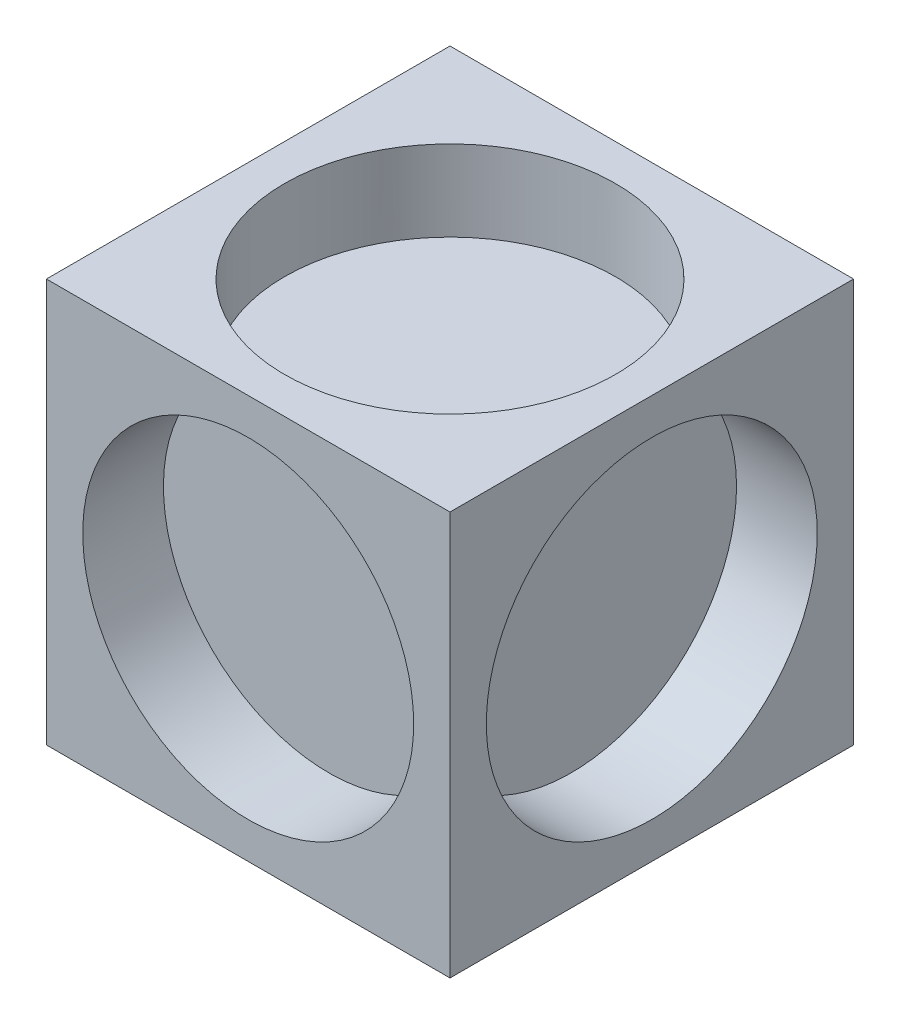
ISO-10303-21;
HEADER;
FILE_DESCRIPTION(('STEP AP214'),'2;1');
FILE_NAME('part.step','',(''),(''),'','','');
FILE_SCHEMA(('AUTOMOTIVE_DESIGN { 1 0 10303 214 1 1 1 1 }'));
ENDSEC;
DATA;
#1=APPLICATION_CONTEXT('core data for automotive mechanical design processes');
#2=APPLICATION_PROTOCOL_DEFINITION('international standard','automotive_design',2000,#1);
#3=PRODUCT_CONTEXT('',#1,'mechanical');
#4=PRODUCT('Part','Part','',(#3));
#5=PRODUCT_RELATED_PRODUCT_CATEGORY('part','',(#4));
#6=PRODUCT_DEFINITION_FORMATION('','',#4);
#7=PRODUCT_DEFINITION_CONTEXT('part definition',#1,'design');
#8=PRODUCT_DEFINITION('design','',#6,#7);
#9=PRODUCT_DEFINITION_SHAPE('','',#8);
#10=(LENGTH_UNIT() NAMED_UNIT(*) SI_UNIT(.MILLI.,.METRE.));
#11=(NAMED_UNIT(*) PLANE_ANGLE_UNIT() SI_UNIT($,.RADIAN.));
#12=(NAMED_UNIT(*) SI_UNIT($,.STERADIAN.) SOLID_ANGLE_UNIT());
#13=UNCERTAINTY_MEASURE_WITH_UNIT(LENGTH_MEASURE(1.E-05),#10,'distance_accuracy_value','');
#14=(GEOMETRIC_REPRESENTATION_CONTEXT(3) GLOBAL_UNCERTAINTY_ASSIGNED_CONTEXT((#13)) GLOBAL_UNIT_ASSIGNED_CONTEXT((#10,
#11,#12)) REPRESENTATION_CONTEXT('',''));
#15=CARTESIAN_POINT('',(0.,0.,0.));
#16=DIRECTION('',(0.,0.,1.));
#17=DIRECTION('',(1.,0.,0.));
#18=AXIS2_PLACEMENT_3D('',#15,#16,#17);
#19=CARTESIAN_POINT('',(0.,3.,0.));
#20=DIRECTION('',(0.,1.,0.));
#21=DIRECTION('',(-1.,0.,0.));
#22=AXIS2_PLACEMENT_3D('',#19,#20,#21);
#23=PLANE('',#22);
#24=CARTESIAN_POINT('',(0.,3.,0.));
#25=DIRECTION('',(0.,1.,0.));
#26=DIRECTION('',(-1.,0.,0.));
#27=AXIS2_PLACEMENT_3D('',#24,#25,#26);
#28=CIRCLE('',#27,4.1);
#29=CARTESIAN_POINT('',(2.79463772249642,3.,3.));
#30=VERTEX_POINT('',#29);
#31=CARTESIAN_POINT('',(3.,3.,2.79463772249642));
#32=VERTEX_POINT('',#31);
#33=EDGE_CURVE('E111',#30,#32,#28,.T.);
#34=ORIENTED_EDGE('',*,*,#33,.T.);
#35=DIRECTION('',(0.,0.,-1.));
#36=VECTOR('',#35,1.);
#37=CARTESIAN_POINT('',(3.,3.,0.));
#38=LINE('',#37,#36);
#39=CARTESIAN_POINT('',(3.,3.,-2.79463772249642));
#40=VERTEX_POINT('',#39);
#41=EDGE_CURVE('E104',#32,#40,#38,.T.);
#42=ORIENTED_EDGE('',*,*,#41,.T.);
#43=CARTESIAN_POINT('',(-2.79463772249642,3.,3.));
#44=VERTEX_POINT('',#43);
#45=EDGE_CURVE('E109',#40,#44,#28,.T.);
#46=ORIENTED_EDGE('',*,*,#45,.T.);
#47=DIRECTION('',(1.,0.,0.));
#48=VECTOR('',#47,1.);
#49=CARTESIAN_POINT('',(0.,3.,3.));
#50=LINE('',#49,#48);
#51=EDGE_CURVE('E43',#44,#30,#50,.T.);
#52=ORIENTED_EDGE('',*,*,#51,.T.);
#53=EDGE_LOOP('',(#34,#42,#46,#52));
#54=FACE_BOUND('',#53,.T.);
#55=ADVANCED_FACE('F35',(#54),#23,.T.);
#56=CARTESIAN_POINT('',(0.,0.,3.));
#57=DIRECTION('',(0.,0.,1.));
#58=DIRECTION('',(1.,0.,0.));
#59=AXIS2_PLACEMENT_3D('',#56,#57,#58);
#60=PLANE('',#59);
#61=CARTESIAN_POINT('',(0.,0.,3.));
#62=DIRECTION('',(0.,0.,1.));
#63=DIRECTION('',(1.,0.,0.));
#64=AXIS2_PLACEMENT_3D('',#61,#62,#63);
#65=CIRCLE('',#64,4.1);
#66=CARTESIAN_POINT('',(3.,-2.79463772249642,3.));
#67=VERTEX_POINT('',#66);
#68=EDGE_CURVE('E160',#44,#67,#65,.T.);
#69=ORIENTED_EDGE('',*,*,#68,.T.);
#70=DIRECTION('',(0.,1.,0.));
#71=VECTOR('',#70,1.);
#72=CARTESIAN_POINT('',(3.,0.,3.));
#73=LINE('',#72,#71);
#74=CARTESIAN_POINT('',(3.,2.79463772249642,3.));
#75=VERTEX_POINT('',#74);
#76=EDGE_CURVE('E11',#67,#75,#73,.T.);
#77=ORIENTED_EDGE('',*,*,#76,.T.);
#78=EDGE_CURVE('E162',#75,#30,#65,.T.);
#79=ORIENTED_EDGE('',*,*,#78,.T.);
#80=ORIENTED_EDGE('',*,*,#51,.F.);
#81=EDGE_LOOP('',(#69,#77,#79,#80));
#82=FACE_BOUND('',#81,.T.);
#83=ADVANCED_FACE('F159',(#82),#60,.T.);
#84=CARTESIAN_POINT('',(-5.,-5.,-5.));
#85=DIRECTION('',(-1.,0.,0.));
#86=DIRECTION('',(0.,0.,1.));
#87=AXIS2_PLACEMENT_3D('',#84,#85,#86);
#88=PLANE('',#87);
#89=DIRECTION('',(0.,0.,1.));
#90=VECTOR('',#89,1.);
#91=CARTESIAN_POINT('',(-5.,-5.,-5.));
#92=LINE('',#91,#90);
#93=CARTESIAN_POINT('',(-5.,-5.,-5.));
#94=VERTEX_POINT('',#93);
#95=CARTESIAN_POINT('',(-5.,-5.,5.));
#96=VERTEX_POINT('',#95);
#97=EDGE_CURVE('E149',#94,#96,#92,.T.);
#98=ORIENTED_EDGE('',*,*,#97,.T.);
#99=DIRECTION('',(0.,-1.,0.));
#100=VECTOR('',#99,1.);
#101=CARTESIAN_POINT('',(-5.,-5.,5.));
#102=LINE('',#101,#100);
#103=CARTESIAN_POINT('',(-5.,5.,5.));
#104=VERTEX_POINT('',#103);
#105=EDGE_CURVE('E120',#104,#96,#102,.T.);
#106=ORIENTED_EDGE('',*,*,#105,.F.);
#107=DIRECTION('',(0.,0.,1.));
#108=VECTOR('',#107,1.);
#109=CARTESIAN_POINT('',(-5.,5.,-5.));
#110=LINE('',#109,#108);
#111=CARTESIAN_POINT('',(-5.,5.,-5.));
#112=VERTEX_POINT('',#111);
#113=EDGE_CURVE('E150',#112,#104,#110,.T.);
#114=ORIENTED_EDGE('',*,*,#113,.F.);
#115=DIRECTION('',(0.,-1.,0.));
#116=VECTOR('',#115,1.);
#117=CARTESIAN_POINT('',(-5.,-5.,-5.));
#118=LINE('',#117,#116);
#119=EDGE_CURVE('E137',#112,#94,#118,.T.);
#120=ORIENTED_EDGE('',*,*,#119,.T.);
#121=EDGE_LOOP('',(#98,#106,#114,#120));
#122=FACE_BOUND('',#121,.T.);
#123=ADVANCED_FACE('F37',(#122),#88,.T.);
#124=CARTESIAN_POINT('',(5.,5.,-5.));
#125=DIRECTION('',(0.,1.,0.));
#126=DIRECTION('',(-1.,0.,0.));
#127=AXIS2_PLACEMENT_3D('',#124,#125,#126);
#128=PLANE('',#127);
#129=CARTESIAN_POINT('',(0.,5.,0.));
#130=DIRECTION('',(0.,1.,0.));
#131=DIRECTION('',(-1.,0.,0.));
#132=AXIS2_PLACEMENT_3D('',#129,#130,#131);
#133=CIRCLE('',#132,4.1);
#134=CARTESIAN_POINT('',(-4.1,5.,0.));
#135=VERTEX_POINT('',#134);
#136=EDGE_CURVE('E118',#135,#135,#133,.T.);
#137=ORIENTED_EDGE('',*,*,#136,.F.);
#138=EDGE_LOOP('',(#137));
#139=FACE_BOUND('',#138,.T.);
#140=ORIENTED_EDGE('',*,*,#113,.T.);
#141=DIRECTION('',(-1.,0.,0.));
#142=VECTOR('',#141,1.);
#143=CARTESIAN_POINT('',(5.,5.,5.));
#144=LINE('',#143,#142);
#145=CARTESIAN_POINT('',(5.,5.,5.));
#146=VERTEX_POINT('',#145);
#147=EDGE_CURVE('E134',#146,#104,#144,.T.);
#148=ORIENTED_EDGE('',*,*,#147,.F.);
#149=DIRECTION('',(0.,0.,1.));
#150=VECTOR('',#149,1.);
#151=CARTESIAN_POINT('',(5.,5.,-5.));
#152=LINE('',#151,#150);
#153=CARTESIAN_POINT('',(5.,5.,-5.));
#154=VERTEX_POINT('',#153);
#155=EDGE_CURVE('E152',#154,#146,#152,.T.);
#156=ORIENTED_EDGE('',*,*,#155,.F.);
#157=DIRECTION('',(-1.,0.,0.));
#158=VECTOR('',#157,1.);
#159=CARTESIAN_POINT('',(5.,5.,-5.));
#160=LINE('',#159,#158);
#161=EDGE_CURVE('E146',#154,#112,#160,.T.);
#162=ORIENTED_EDGE('',*,*,#161,.T.);
#163=EDGE_LOOP('',(#140,#148,#156,#162));
#164=FACE_BOUND('',#163,.T.);
#165=ADVANCED_FACE('F191',(#139,#164),#128,.T.);
#166=CARTESIAN_POINT('',(5.,-5.,-5.));
#167=DIRECTION('',(1.,0.,0.));
#168=DIRECTION('',(0.,0.,-1.));
#169=AXIS2_PLACEMENT_3D('',#166,#167,#168);
#170=PLANE('',#169);
#171=CARTESIAN_POINT('',(5.,0.,0.));
#172=DIRECTION('',(1.,0.,0.));
#173=DIRECTION('',(0.,0.,-1.));
#174=AXIS2_PLACEMENT_3D('',#171,#172,#173);
#175=CIRCLE('',#174,4.1);
#176=CARTESIAN_POINT('',(5.,0.,-4.1));
#177=VERTEX_POINT('',#176);
#178=EDGE_CURVE('E105',#177,#177,#175,.T.);
#179=ORIENTED_EDGE('',*,*,#178,.F.);
#180=EDGE_LOOP('',(#179));
#181=FACE_BOUND('',#180,.T.);
#182=ORIENTED_EDGE('',*,*,#155,.T.);
#183=DIRECTION('',(0.,1.,0.));
#184=VECTOR('',#183,1.);
#185=CARTESIAN_POINT('',(5.,-5.,5.));
#186=LINE('',#185,#184);
#187=CARTESIAN_POINT('',(5.,-5.,5.));
#188=VERTEX_POINT('',#187);
#189=EDGE_CURVE('E131',#188,#146,#186,.T.);
#190=ORIENTED_EDGE('',*,*,#189,.F.);
#191=DIRECTION('',(0.,0.,1.));
#192=VECTOR('',#191,1.);
#193=CARTESIAN_POINT('',(5.,-5.,-5.));
#194=LINE('',#193,#192);
#195=CARTESIAN_POINT('',(5.,-5.,-5.));
#196=VERTEX_POINT('',#195);
#197=EDGE_CURVE('E154',#196,#188,#194,.T.);
#198=ORIENTED_EDGE('',*,*,#197,.F.);
#199=DIRECTION('',(0.,1.,0.));
#200=VECTOR('',#199,1.);
#201=CARTESIAN_POINT('',(5.,-5.,-5.));
#202=LINE('',#201,#200);
#203=EDGE_CURVE('E143',#196,#154,#202,.T.);
#204=ORIENTED_EDGE('',*,*,#203,.T.);
#205=EDGE_LOOP('',(#182,#190,#198,#204));
#206=FACE_BOUND('',#205,.T.);
#207=ADVANCED_FACE('F187',(#181,#206),#170,.T.);
#208=CARTESIAN_POINT('',(5.,-5.,-5.));
#209=DIRECTION('',(0.,-1.,0.));
#210=DIRECTION('',(1.,0.,0.));
#211=AXIS2_PLACEMENT_3D('',#208,#209,#210);
#212=PLANE('',#211);
#213=ORIENTED_EDGE('',*,*,#197,.T.);
#214=DIRECTION('',(1.,0.,0.));
#215=VECTOR('',#214,1.);
#216=CARTESIAN_POINT('',(5.,-5.,5.));
#217=LINE('',#216,#215);
#218=EDGE_CURVE('E128',#96,#188,#217,.T.);
#219=ORIENTED_EDGE('',*,*,#218,.F.);
#220=ORIENTED_EDGE('',*,*,#97,.F.);
#221=DIRECTION('',(1.,0.,0.));
#222=VECTOR('',#221,1.);
#223=CARTESIAN_POINT('',(5.,-5.,-5.));
#224=LINE('',#223,#222);
#225=EDGE_CURVE('E140',#94,#196,#224,.T.);
#226=ORIENTED_EDGE('',*,*,#225,.T.);
#227=EDGE_LOOP('',(#213,#219,#220,#226));
#228=FACE_BOUND('',#227,.T.);
#229=ADVANCED_FACE('F184',(#228),#212,.T.);
#230=CARTESIAN_POINT('',(0.,0.,-5.));
#231=DIRECTION('',(0.,0.,1.));
#232=DIRECTION('',(1.,0.,0.));
#233=AXIS2_PLACEMENT_3D('',#230,#231,#232);
#234=PLANE('',#233);
#235=ORIENTED_EDGE('',*,*,#119,.F.);
#236=ORIENTED_EDGE('',*,*,#161,.F.);
#237=ORIENTED_EDGE('',*,*,#203,.F.);
#238=ORIENTED_EDGE('',*,*,#225,.F.);
#239=EDGE_LOOP('',(#235,#236,#237,#238));
#240=FACE_BOUND('',#239,.T.);
#241=ADVANCED_FACE('F174',(#240),#234,.F.);
#242=CARTESIAN_POINT('',(0.,0.,5.));
#243=DIRECTION('',(0.,0.,1.));
#244=DIRECTION('',(1.,0.,0.));
#245=AXIS2_PLACEMENT_3D('',#242,#243,#244);
#246=PLANE('',#245);
#247=CARTESIAN_POINT('',(0.,0.,5.));
#248=DIRECTION('',(0.,0.,1.));
#249=DIRECTION('',(1.,0.,0.));
#250=AXIS2_PLACEMENT_3D('',#247,#248,#249);
#251=CIRCLE('',#250,4.1);
#252=CARTESIAN_POINT('',(4.1,0.,5.));
#253=VERTEX_POINT('',#252);
#254=EDGE_CURVE('E99',#253,#253,#251,.T.);
#255=ORIENTED_EDGE('',*,*,#254,.F.);
#256=EDGE_LOOP('',(#255));
#257=FACE_BOUND('',#256,.T.);
#258=ORIENTED_EDGE('',*,*,#105,.T.);
#259=ORIENTED_EDGE('',*,*,#218,.T.);
#260=ORIENTED_EDGE('',*,*,#189,.T.);
#261=ORIENTED_EDGE('',*,*,#147,.T.);
#262=EDGE_LOOP('',(#258,#259,#260,#261));
#263=FACE_BOUND('',#262,.T.);
#264=ADVANCED_FACE('F171',(#257,#263),#246,.T.);
#265=CARTESIAN_POINT('',(0.,3.,0.));
#266=DIRECTION('',(0.,1.,0.));
#267=DIRECTION('',(-1.,0.,0.));
#268=AXIS2_PLACEMENT_3D('',#265,#266,#267);
#269=CYLINDRICAL_SURFACE('',#268,4.1);
#270=ORIENTED_EDGE('',*,*,#45,.F.);
#271=CARTESIAN_POINT('',(0.,0.,0.));
#272=DIRECTION('',(-0.707106781186548,0.707106781186547,0.));
#273=DIRECTION('',(0.707106781186547,0.707106781186548,0.));
#274=AXIS2_PLACEMENT_3D('',#271,#272,#273);
#275=ELLIPSE('',#274,5.79827560572969,4.1);
#276=EDGE_CURVE('E90',#40,#32,#275,.F.);
#277=ORIENTED_EDGE('',*,*,#276,.T.);
#278=ORIENTED_EDGE('',*,*,#33,.F.);
#279=CARTESIAN_POINT('',(0.,0.,0.));
#280=DIRECTION('',(0.,0.707106781186547,-0.707106781186547));
#281=DIRECTION('',(0.,0.707106781186547,0.707106781186547));
#282=AXIS2_PLACEMENT_3D('',#279,#280,#281);
#283=ELLIPSE('',#282,5.79827560572969,4.1);
#284=EDGE_CURVE('E117',#30,#44,#283,.F.);
#285=ORIENTED_EDGE('',*,*,#284,.T.);
#286=EDGE_LOOP('',(#270,#277,#278,#285));
#287=FACE_BOUND('',#286,.T.);
#288=ORIENTED_EDGE('',*,*,#136,.T.);
#289=EDGE_LOOP('',(#288));
#290=FACE_BOUND('',#289,.T.);
#291=ADVANCED_FACE('F114',(#287,#290),#269,.F.);
#292=CARTESIAN_POINT('',(0.,0.,3.));
#293=DIRECTION('',(0.,0.,1.));
#294=DIRECTION('',(1.,0.,0.));
#295=AXIS2_PLACEMENT_3D('',#292,#293,#294);
#296=CYLINDRICAL_SURFACE('',#295,4.1);
#297=ORIENTED_EDGE('',*,*,#254,.T.);
#298=EDGE_LOOP('',(#297));
#299=FACE_BOUND('',#298,.T.);
#300=ORIENTED_EDGE('',*,*,#78,.F.);
#301=CARTESIAN_POINT('',(0.,0.,0.));
#302=DIRECTION('',(-0.707106781186547,0.,0.707106781186547));
#303=DIRECTION('',(0.707106781186547,0.,0.707106781186547));
#304=AXIS2_PLACEMENT_3D('',#301,#302,#303);
#305=ELLIPSE('',#304,5.79827560572969,4.1);
#306=EDGE_CURVE('E100',#75,#67,#305,.F.);
#307=ORIENTED_EDGE('',*,*,#306,.T.);
#308=ORIENTED_EDGE('',*,*,#68,.F.);
#309=ORIENTED_EDGE('',*,*,#284,.F.);
#310=EDGE_LOOP('',(#300,#307,#308,#309));
#311=FACE_BOUND('',#310,.T.);
#312=ADVANCED_FACE('F164',(#299,#311),#296,.F.);
#313=CARTESIAN_POINT('',(3.,0.,0.));
#314=DIRECTION('',(1.,0.,0.));
#315=DIRECTION('',(0.,0.,-1.));
#316=AXIS2_PLACEMENT_3D('',#313,#314,#315);
#317=CYLINDRICAL_SURFACE('',#316,4.1);
#318=ORIENTED_EDGE('',*,*,#178,.T.);
#319=EDGE_LOOP('',(#318));
#320=FACE_BOUND('',#319,.T.);
#321=CARTESIAN_POINT('',(3.,0.,0.));
#322=DIRECTION('',(1.,0.,0.));
#323=DIRECTION('',(0.,0.,-1.));
#324=AXIS2_PLACEMENT_3D('',#321,#322,#323);
#325=CIRCLE('',#324,4.1);
#326=EDGE_CURVE('E93',#67,#40,#325,.T.);
#327=ORIENTED_EDGE('',*,*,#326,.F.);
#328=ORIENTED_EDGE('',*,*,#306,.F.);
#329=EDGE_CURVE('E50',#32,#75,#325,.T.);
#330=ORIENTED_EDGE('',*,*,#329,.F.);
#331=ORIENTED_EDGE('',*,*,#276,.F.);
#332=EDGE_LOOP('',(#327,#328,#330,#331));
#333=FACE_BOUND('',#332,.T.);
#334=ADVANCED_FACE('F92',(#320,#333),#317,.F.);
#335=CARTESIAN_POINT('',(3.,0.,0.));
#336=DIRECTION('',(1.,0.,0.));
#337=DIRECTION('',(0.,0.,-1.));
#338=AXIS2_PLACEMENT_3D('',#335,#336,#337);
#339=PLANE('',#338);
#340=ORIENTED_EDGE('',*,*,#329,.T.);
#341=ORIENTED_EDGE('',*,*,#76,.F.);
#342=ORIENTED_EDGE('',*,*,#326,.T.);
#343=ORIENTED_EDGE('',*,*,#41,.F.);
#344=EDGE_LOOP('',(#340,#341,#342,#343));
#345=FACE_BOUND('',#344,.T.);
#346=ADVANCED_FACE('F103',(#345),#339,.T.);
#347=CLOSED_SHELL('',(#55,#83,#123,#165,#207,#229,#241,#264,#291,#312,#334,#346));
#348=MANIFOLD_SOLID_BREP('B2',#347);
#349=ADVANCED_BREP_SHAPE_REPRESENTATION('',(#18,#348),#14);
#350=SHAPE_DEFINITION_REPRESENTATION(#9,#349);
ENDSEC;
END-ISO-10303-21;
